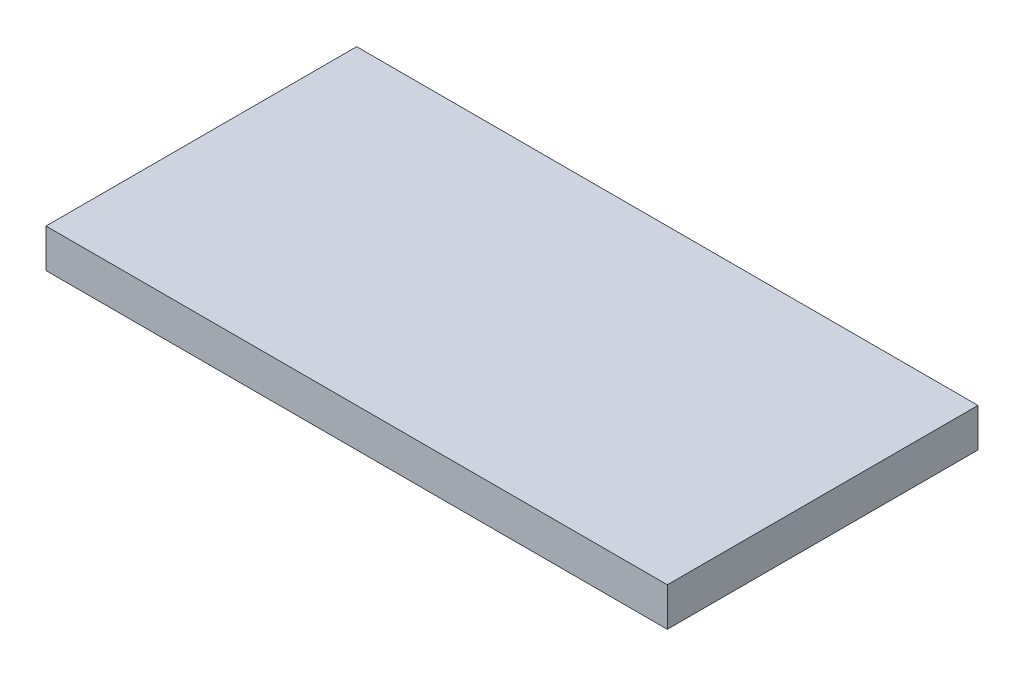
ISO-10303-21;
HEADER;
FILE_DESCRIPTION(('STEP AP214'),'2;1');
FILE_NAME('part.step','',(''),(''),'','','');
FILE_SCHEMA(('AUTOMOTIVE_DESIGN { 1 0 10303 214 1 1 1 1 }'));
ENDSEC;
DATA;
#1=APPLICATION_CONTEXT('core data for automotive mechanical design processes');
#2=APPLICATION_PROTOCOL_DEFINITION('international standard','automotive_design',2000,#1);
#3=PRODUCT_CONTEXT('',#1,'mechanical');
#4=PRODUCT('Part','Part','',(#3));
#5=PRODUCT_RELATED_PRODUCT_CATEGORY('part','',(#4));
#6=PRODUCT_DEFINITION_FORMATION('','',#4);
#7=PRODUCT_DEFINITION_CONTEXT('part definition',#1,'design');
#8=PRODUCT_DEFINITION('design','',#6,#7);
#9=PRODUCT_DEFINITION_SHAPE('','',#8);
#10=(LENGTH_UNIT() NAMED_UNIT(*) SI_UNIT(.MILLI.,.METRE.));
#11=(NAMED_UNIT(*) PLANE_ANGLE_UNIT() SI_UNIT($,.RADIAN.));
#12=(NAMED_UNIT(*) SI_UNIT($,.STERADIAN.) SOLID_ANGLE_UNIT());
#13=UNCERTAINTY_MEASURE_WITH_UNIT(LENGTH_MEASURE(1.E-05),#10,'distance_accuracy_value','');
#14=(GEOMETRIC_REPRESENTATION_CONTEXT(3) GLOBAL_UNCERTAINTY_ASSIGNED_CONTEXT((#13)) GLOBAL_UNIT_ASSIGNED_CONTEXT((#10,
#11,#12)) REPRESENTATION_CONTEXT('',''));
#15=CARTESIAN_POINT('',(0.,0.,0.));
#16=DIRECTION('',(0.,0.,1.));
#17=DIRECTION('',(1.,0.,0.));
#18=AXIS2_PLACEMENT_3D('',#15,#16,#17);
#19=CARTESIAN_POINT('',(50.8,6.31,-25.4));
#20=DIRECTION('',(-1.,0.,0.));
#21=DIRECTION('',(0.,0.,1.));
#22=AXIS2_PLACEMENT_3D('',#19,#20,#21);
#23=PLANE('',#22);
#24=DIRECTION('',(0.,0.,-1.));
#25=VECTOR('',#24,1.);
#26=CARTESIAN_POINT('',(50.8,0.,-25.4));
#27=LINE('',#26,#25);
#28=CARTESIAN_POINT('',(50.8,0.,25.4));
#29=VERTEX_POINT('',#28);
#30=CARTESIAN_POINT('',(50.8,0.,-25.4));
#31=VERTEX_POINT('',#30);
#32=EDGE_CURVE('E98',#29,#31,#27,.T.);
#33=ORIENTED_EDGE('',*,*,#32,.T.);
#34=DIRECTION('',(0.,-1.,0.));
#35=VECTOR('',#34,1.);
#36=CARTESIAN_POINT('',(50.8,6.31,-25.4));
#37=LINE('',#36,#35);
#38=CARTESIAN_POINT('',(50.8,6.31,-25.4));
#39=VERTEX_POINT('',#38);
#40=EDGE_CURVE('E11',#39,#31,#37,.T.);
#41=ORIENTED_EDGE('',*,*,#40,.F.);
#42=DIRECTION('',(0.,0.,-1.));
#43=VECTOR('',#42,1.);
#44=CARTESIAN_POINT('',(50.8,6.31,-25.4));
#45=LINE('',#44,#43);
#46=CARTESIAN_POINT('',(50.8,6.31,25.4));
#47=VERTEX_POINT('',#46);
#48=EDGE_CURVE('E86',#47,#39,#45,.T.);
#49=ORIENTED_EDGE('',*,*,#48,.F.);
#50=DIRECTION('',(0.,-1.,0.));
#51=VECTOR('',#50,1.);
#52=CARTESIAN_POINT('',(50.8,6.31,25.4));
#53=LINE('',#52,#51);
#54=EDGE_CURVE('E94',#47,#29,#53,.T.);
#55=ORIENTED_EDGE('',*,*,#54,.T.);
#56=EDGE_LOOP('',(#33,#41,#49,#55));
#57=FACE_BOUND('',#56,.T.);
#58=ADVANCED_FACE('F35',(#57),#23,.F.);
#59=CARTESIAN_POINT('',(-50.8,6.31,-25.4));
#60=DIRECTION('',(0.,0.,1.));
#61=DIRECTION('',(1.,0.,0.));
#62=AXIS2_PLACEMENT_3D('',#59,#60,#61);
#63=PLANE('',#62);
#64=DIRECTION('',(-1.,0.,0.));
#65=VECTOR('',#64,1.);
#66=CARTESIAN_POINT('',(-50.8,0.,-25.4));
#67=LINE('',#66,#65);
#68=CARTESIAN_POINT('',(-50.8,0.,-25.4));
#69=VERTEX_POINT('',#68);
#70=EDGE_CURVE('E90',#31,#69,#67,.T.);
#71=ORIENTED_EDGE('',*,*,#70,.T.);
#72=DIRECTION('',(0.,-1.,0.));
#73=VECTOR('',#72,1.);
#74=CARTESIAN_POINT('',(-50.8,6.31,-25.4));
#75=LINE('',#74,#73);
#76=CARTESIAN_POINT('',(-50.8,6.31,-25.4));
#77=VERTEX_POINT('',#76);
#78=EDGE_CURVE('E43',#77,#69,#75,.T.);
#79=ORIENTED_EDGE('',*,*,#78,.F.);
#80=DIRECTION('',(-1.,0.,0.));
#81=VECTOR('',#80,1.);
#82=CARTESIAN_POINT('',(-50.8,6.31,-25.4));
#83=LINE('',#82,#81);
#84=EDGE_CURVE('E81',#39,#77,#83,.T.);
#85=ORIENTED_EDGE('',*,*,#84,.F.);
#86=ORIENTED_EDGE('',*,*,#40,.T.);
#87=EDGE_LOOP('',(#71,#79,#85,#86));
#88=FACE_BOUND('',#87,.T.);
#89=ADVANCED_FACE('F89',(#88),#63,.F.);
#90=CARTESIAN_POINT('',(-50.8,6.31,-25.4));
#91=DIRECTION('',(1.,0.,0.));
#92=DIRECTION('',(0.,0.,-1.));
#93=AXIS2_PLACEMENT_3D('',#90,#91,#92);
#94=PLANE('',#93);
#95=DIRECTION('',(0.,0.,1.));
#96=VECTOR('',#95,1.);
#97=CARTESIAN_POINT('',(-50.8,0.,-25.4));
#98=LINE('',#97,#96);
#99=CARTESIAN_POINT('',(-50.8,0.,25.4));
#100=VERTEX_POINT('',#99);
#101=EDGE_CURVE('E68',#69,#100,#98,.T.);
#102=ORIENTED_EDGE('',*,*,#101,.T.);
#103=DIRECTION('',(0.,-1.,0.));
#104=VECTOR('',#103,1.);
#105=CARTESIAN_POINT('',(-50.8,6.31,25.4));
#106=LINE('',#105,#104);
#107=CARTESIAN_POINT('',(-50.8,6.31,25.4));
#108=VERTEX_POINT('',#107);
#109=EDGE_CURVE('E91',#108,#100,#106,.T.);
#110=ORIENTED_EDGE('',*,*,#109,.F.);
#111=DIRECTION('',(0.,0.,1.));
#112=VECTOR('',#111,1.);
#113=CARTESIAN_POINT('',(-50.8,6.31,-25.4));
#114=LINE('',#113,#112);
#115=EDGE_CURVE('E84',#77,#108,#114,.T.);
#116=ORIENTED_EDGE('',*,*,#115,.F.);
#117=ORIENTED_EDGE('',*,*,#78,.T.);
#118=EDGE_LOOP('',(#102,#110,#116,#117));
#119=FACE_BOUND('',#118,.T.);
#120=ADVANCED_FACE('F92',(#119),#94,.F.);
#121=CARTESIAN_POINT('',(-50.8,6.31,25.4));
#122=DIRECTION('',(0.,0.,-1.));
#123=DIRECTION('',(-1.,0.,0.));
#124=AXIS2_PLACEMENT_3D('',#121,#122,#123);
#125=PLANE('',#124);
#126=DIRECTION('',(1.,0.,0.));
#127=VECTOR('',#126,1.);
#128=CARTESIAN_POINT('',(-50.8,0.,25.4));
#129=LINE('',#128,#127);
#130=EDGE_CURVE('E74',#100,#29,#129,.T.);
#131=ORIENTED_EDGE('',*,*,#130,.T.);
#132=ORIENTED_EDGE('',*,*,#54,.F.);
#133=DIRECTION('',(1.,0.,0.));
#134=VECTOR('',#133,1.);
#135=CARTESIAN_POINT('',(-50.8,6.31,25.4));
#136=LINE('',#135,#134);
#137=EDGE_CURVE('E51',#108,#47,#136,.T.);
#138=ORIENTED_EDGE('',*,*,#137,.F.);
#139=ORIENTED_EDGE('',*,*,#109,.T.);
#140=EDGE_LOOP('',(#131,#132,#138,#139));
#141=FACE_BOUND('',#140,.T.);
#142=ADVANCED_FACE('F105',(#141),#125,.F.);
#143=CARTESIAN_POINT('',(0.,6.31,0.));
#144=DIRECTION('',(0.,1.,0.));
#145=DIRECTION('',(0.,0.,1.));
#146=AXIS2_PLACEMENT_3D('',#143,#144,#145);
#147=PLANE('',#146);
#148=ORIENTED_EDGE('',*,*,#48,.T.);
#149=ORIENTED_EDGE('',*,*,#84,.T.);
#150=ORIENTED_EDGE('',*,*,#115,.T.);
#151=ORIENTED_EDGE('',*,*,#137,.T.);
#152=EDGE_LOOP('',(#148,#149,#150,#151));
#153=FACE_BOUND('',#152,.T.);
#154=ADVANCED_FACE('F82',(#153),#147,.T.);
#155=CARTESIAN_POINT('',(0.,0.,0.));
#156=DIRECTION('',(0.,1.,0.));
#157=DIRECTION('',(0.,0.,1.));
#158=AXIS2_PLACEMENT_3D('',#155,#156,#157);
#159=PLANE('',#158);
#160=ORIENTED_EDGE('',*,*,#32,.F.);
#161=ORIENTED_EDGE('',*,*,#130,.F.);
#162=ORIENTED_EDGE('',*,*,#101,.F.);
#163=ORIENTED_EDGE('',*,*,#70,.F.);
#164=EDGE_LOOP('',(#160,#161,#162,#163));
#165=FACE_BOUND('',#164,.T.);
#166=ADVANCED_FACE('F108',(#165),#159,.F.);
#167=CLOSED_SHELL('',(#58,#89,#120,#142,#154,#166));
#168=MANIFOLD_SOLID_BREP('B2',#167);
#169=ADVANCED_BREP_SHAPE_REPRESENTATION('',(#18,#168),#14);
#170=SHAPE_DEFINITION_REPRESENTATION(#9,#169);
ENDSEC;
END-ISO-10303-21;
